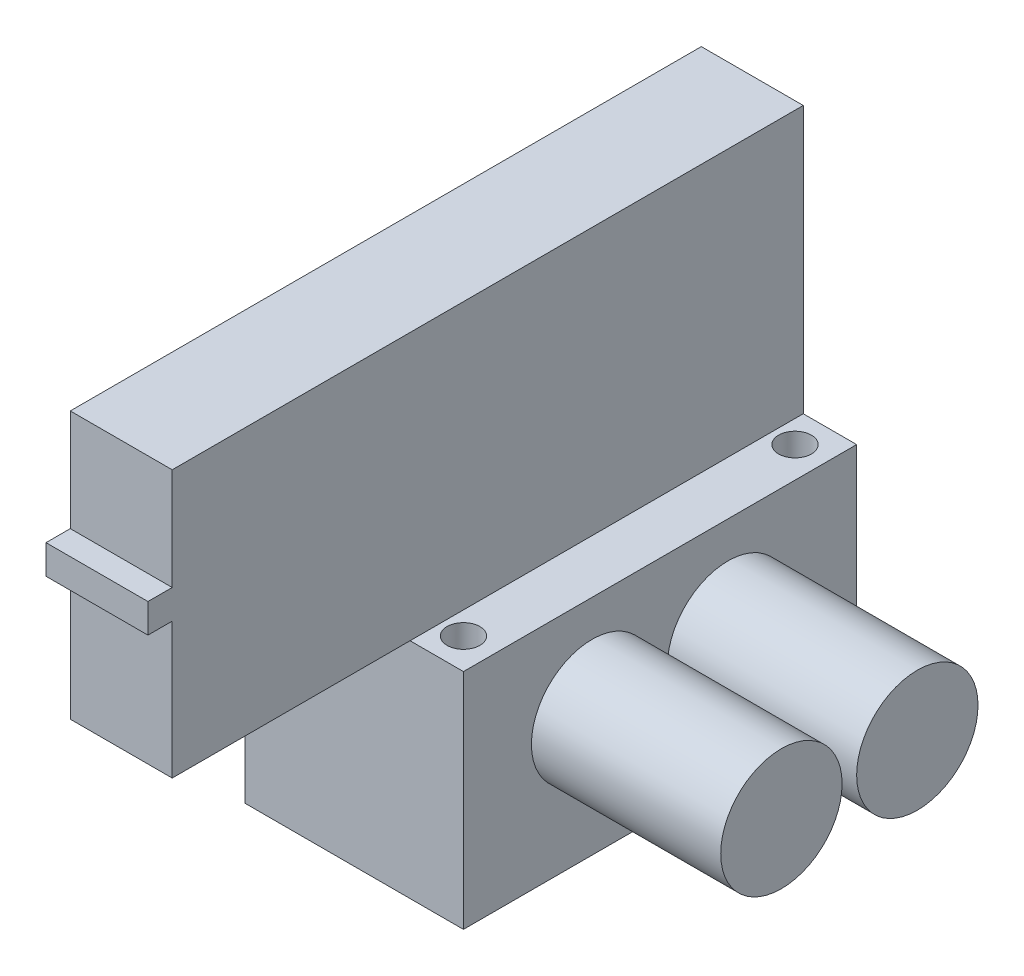
ISO-10303-21;
HEADER;
FILE_DESCRIPTION(('STEP AP214'),'2;1');
FILE_NAME('part.step','',(''),(''),'','','');
FILE_SCHEMA(('AUTOMOTIVE_DESIGN { 1 0 10303 214 1 1 1 1 }'));
ENDSEC;
DATA;
#1=APPLICATION_CONTEXT('core data for automotive mechanical design processes');
#2=APPLICATION_PROTOCOL_DEFINITION('international standard','automotive_design',2000,#1);
#3=PRODUCT_CONTEXT('',#1,'mechanical');
#4=PRODUCT('Part','Part','',(#3));
#5=PRODUCT_RELATED_PRODUCT_CATEGORY('part','',(#4));
#6=PRODUCT_DEFINITION_FORMATION('','',#4);
#7=PRODUCT_DEFINITION_CONTEXT('part definition',#1,'design');
#8=PRODUCT_DEFINITION('design','',#6,#7);
#9=PRODUCT_DEFINITION_SHAPE('','',#8);
#10=(LENGTH_UNIT() NAMED_UNIT(*) SI_UNIT(.MILLI.,.METRE.));
#11=(NAMED_UNIT(*) PLANE_ANGLE_UNIT() SI_UNIT($,.RADIAN.));
#12=(NAMED_UNIT(*) SI_UNIT($,.STERADIAN.) SOLID_ANGLE_UNIT());
#13=UNCERTAINTY_MEASURE_WITH_UNIT(LENGTH_MEASURE(1.E-05),#10,'distance_accuracy_value','');
#14=(GEOMETRIC_REPRESENTATION_CONTEXT(3) GLOBAL_UNCERTAINTY_ASSIGNED_CONTEXT((#13)) GLOBAL_UNIT_ASSIGNED_CONTEXT((#10,
#11,#12)) REPRESENTATION_CONTEXT('',''));
#15=CARTESIAN_POINT('',(0.,0.,0.));
#16=DIRECTION('',(0.,0.,1.));
#17=DIRECTION('',(1.,0.,0.));
#18=AXIS2_PLACEMENT_3D('',#15,#16,#17);
#19=CARTESIAN_POINT('',(6.60400000000001,51.308,24.892));
#20=DIRECTION('',(0.,0.,-1.));
#21=DIRECTION('',(-1.,0.,0.));
#22=AXIS2_PLACEMENT_3D('',#19,#20,#21);
#23=PLANE('',#22);
#24=DIRECTION('',(-1.,0.,0.));
#25=VECTOR('',#24,1.);
#26=CARTESIAN_POINT('',(6.60400000000001,40.64,24.892));
#27=LINE('',#26,#25);
#28=CARTESIAN_POINT('',(17.272,40.64,24.892));
#29=VERTEX_POINT('',#28);
#30=CARTESIAN_POINT('',(6.60400000000001,40.64,24.892));
#31=VERTEX_POINT('',#30);
#32=EDGE_CURVE('E151',#29,#31,#27,.T.);
#33=ORIENTED_EDGE('',*,*,#32,.F.);
#34=DIRECTION('',(0.,-1.,0.));
#35=VECTOR('',#34,1.);
#36=CARTESIAN_POINT('',(17.272,51.308,24.892));
#37=LINE('',#36,#35);
#38=CARTESIAN_POINT('',(17.272,51.308,24.892));
#39=VERTEX_POINT('',#38);
#40=EDGE_CURVE('E216',#39,#29,#37,.T.);
#41=ORIENTED_EDGE('',*,*,#40,.F.);
#42=DIRECTION('',(1.,0.,0.));
#43=VECTOR('',#42,1.);
#44=CARTESIAN_POINT('',(6.60400000000001,51.308,24.892));
#45=LINE('',#44,#43);
#46=CARTESIAN_POINT('',(6.60400000000001,51.308,24.892));
#47=VERTEX_POINT('',#46);
#48=EDGE_CURVE('E187',#47,#39,#45,.T.);
#49=ORIENTED_EDGE('',*,*,#48,.F.);
#50=DIRECTION('',(0.,-1.,0.));
#51=VECTOR('',#50,1.);
#52=CARTESIAN_POINT('',(6.60400000000001,51.308,24.892));
#53=LINE('',#52,#51);
#54=EDGE_CURVE('E60',#47,#31,#53,.T.);
#55=ORIENTED_EDGE('',*,*,#54,.T.);
#56=EDGE_LOOP('',(#33,#41,#49,#55));
#57=FACE_BOUND('',#56,.T.);
#58=ADVANCED_FACE('F35',(#57),#23,.F.);
#59=DIRECTION('',(1.,0.,0.));
#60=VECTOR('',#59,1.);
#61=CARTESIAN_POINT('',(6.60400000000001,37.592,24.892));
#62=LINE('',#61,#60);
#63=CARTESIAN_POINT('',(6.60400000000001,37.592,24.892));
#64=VERTEX_POINT('',#63);
#65=CARTESIAN_POINT('',(17.272,37.592,24.892));
#66=VERTEX_POINT('',#65);
#67=EDGE_CURVE('E52',#64,#66,#62,.T.);
#68=ORIENTED_EDGE('',*,*,#67,.F.);
#69=CARTESIAN_POINT('',(6.60400000000001,23.368,24.892));
#70=VERTEX_POINT('',#69);
#71=EDGE_CURVE('E156',#64,#70,#53,.T.);
#72=ORIENTED_EDGE('',*,*,#71,.T.);
#73=DIRECTION('',(1.,0.,0.));
#74=VECTOR('',#73,1.);
#75=CARTESIAN_POINT('',(6.60400000000001,23.368,24.892));
#76=LINE('',#75,#74);
#77=CARTESIAN_POINT('',(17.272,23.368,24.892));
#78=VERTEX_POINT('',#77);
#79=EDGE_CURVE('E198',#70,#78,#76,.T.);
#80=ORIENTED_EDGE('',*,*,#79,.T.);
#81=EDGE_CURVE('E220',#66,#78,#37,.T.);
#82=ORIENTED_EDGE('',*,*,#81,.F.);
#83=EDGE_LOOP('',(#68,#72,#80,#82));
#84=FACE_BOUND('',#83,.T.);
#85=ADVANCED_FACE('F238',(#84),#23,.F.);
#86=CARTESIAN_POINT('',(22.86,23.368,0.));
#87=DIRECTION('',(-1.,0.,0.));
#88=DIRECTION('',(0.,0.,1.));
#89=AXIS2_PLACEMENT_3D('',#86,#87,#88);
#90=PLANE('',#89);
#91=CARTESIAN_POINT('',(22.86,13.208,-27.686));
#92=DIRECTION('',(-1.,0.,0.));
#93=DIRECTION('',(0.,0.,1.));
#94=AXIS2_PLACEMENT_3D('',#91,#92,#93);
#95=CIRCLE('',#94,6.35);
#96=CARTESIAN_POINT('',(22.86,13.208,-21.336));
#97=VERTEX_POINT('',#96);
#98=EDGE_CURVE('E44',#97,#97,#95,.F.);
#99=ORIENTED_EDGE('',*,*,#98,.F.);
#100=EDGE_LOOP('',(#99));
#101=FACE_BOUND('',#100,.T.);
#102=DIRECTION('',(0.,0.,-1.));
#103=VECTOR('',#102,1.);
#104=CARTESIAN_POINT('',(22.86,0.,0.));
#105=LINE('',#104,#103);
#106=CARTESIAN_POINT('',(22.86,0.,0.));
#107=VERTEX_POINT('',#106);
#108=CARTESIAN_POINT('',(22.86,0.,-41.148));
#109=VERTEX_POINT('',#108);
#110=EDGE_CURVE('E268',#107,#109,#105,.T.);
#111=ORIENTED_EDGE('',*,*,#110,.T.);
#112=DIRECTION('',(0.,-1.,0.));
#113=VECTOR('',#112,1.);
#114=CARTESIAN_POINT('',(22.86,23.368,-41.148));
#115=LINE('',#114,#113);
#116=CARTESIAN_POINT('',(22.86,23.368,-41.148));
#117=VERTEX_POINT('',#116);
#118=EDGE_CURVE('E275',#117,#109,#115,.T.);
#119=ORIENTED_EDGE('',*,*,#118,.F.);
#120=DIRECTION('',(0.,0.,-1.));
#121=VECTOR('',#120,1.);
#122=CARTESIAN_POINT('',(22.86,23.368,0.));
#123=LINE('',#122,#121);
#124=CARTESIAN_POINT('',(22.86,23.368,0.));
#125=VERTEX_POINT('',#124);
#126=EDGE_CURVE('E261',#125,#117,#123,.T.);
#127=ORIENTED_EDGE('',*,*,#126,.F.);
#128=DIRECTION('',(0.,-1.,0.));
#129=VECTOR('',#128,1.);
#130=CARTESIAN_POINT('',(22.86,23.368,0.));
#131=LINE('',#130,#129);
#132=EDGE_CURVE('E278',#125,#107,#131,.T.);
#133=ORIENTED_EDGE('',*,*,#132,.T.);
#134=EDGE_LOOP('',(#111,#119,#127,#133));
#135=FACE_BOUND('',#134,.T.);
#136=CARTESIAN_POINT('',(22.86,13.208,-13.462));
#137=DIRECTION('',(-1.,0.,0.));
#138=DIRECTION('',(0.,0.,1.));
#139=AXIS2_PLACEMENT_3D('',#136,#137,#138);
#140=CIRCLE('',#139,6.35);
#141=CARTESIAN_POINT('',(22.86,13.208,-7.112));
#142=VERTEX_POINT('',#141);
#143=EDGE_CURVE('E11',#142,#142,#140,.F.);
#144=ORIENTED_EDGE('',*,*,#143,.F.);
#145=EDGE_LOOP('',(#144));
#146=FACE_BOUND('',#145,.T.);
#147=ADVANCED_FACE('F299',(#101,#135,#146),#90,.F.);
#148=CARTESIAN_POINT('',(0.,23.368,0.));
#149=DIRECTION('',(1.,0.,0.));
#150=DIRECTION('',(0.,0.,-1.));
#151=AXIS2_PLACEMENT_3D('',#148,#149,#150);
#152=PLANE('',#151);
#153=DIRECTION('',(0.,0.,1.));
#154=VECTOR('',#153,1.);
#155=CARTESIAN_POINT('',(0.,0.,0.));
#156=LINE('',#155,#154);
#157=CARTESIAN_POINT('',(0.,0.,-41.148));
#158=VERTEX_POINT('',#157);
#159=CARTESIAN_POINT('',(0.,0.,0.));
#160=VERTEX_POINT('',#159);
#161=EDGE_CURVE('E233',#158,#160,#156,.T.);
#162=ORIENTED_EDGE('',*,*,#161,.T.);
#163=DIRECTION('',(0.,-1.,0.));
#164=VECTOR('',#163,1.);
#165=CARTESIAN_POINT('',(0.,23.368,0.));
#166=LINE('',#165,#164);
#167=CARTESIAN_POINT('',(0.,23.368,0.));
#168=VERTEX_POINT('',#167);
#169=EDGE_CURVE('E256',#168,#160,#166,.T.);
#170=ORIENTED_EDGE('',*,*,#169,.F.);
#171=DIRECTION('',(0.,0.,1.));
#172=VECTOR('',#171,1.);
#173=CARTESIAN_POINT('',(0.,23.368,0.));
#174=LINE('',#173,#172);
#175=CARTESIAN_POINT('',(0.,23.368,-41.148));
#176=VERTEX_POINT('',#175);
#177=EDGE_CURVE('E228',#176,#168,#174,.T.);
#178=ORIENTED_EDGE('',*,*,#177,.F.);
#179=DIRECTION('',(0.,-1.,0.));
#180=VECTOR('',#179,1.);
#181=CARTESIAN_POINT('',(0.,23.368,-41.148));
#182=LINE('',#181,#180);
#183=EDGE_CURVE('E272',#176,#158,#182,.T.);
#184=ORIENTED_EDGE('',*,*,#183,.T.);
#185=EDGE_LOOP('',(#162,#170,#178,#184));
#186=FACE_BOUND('',#185,.T.);
#187=CARTESIAN_POINT('',(0.,16.256,-20.828));
#188=DIRECTION('',(1.,0.,0.));
#189=DIRECTION('',(0.,0.,-1.));
#190=AXIS2_PLACEMENT_3D('',#187,#188,#189);
#191=CIRCLE('',#190,6.35);
#192=CARTESIAN_POINT('',(0.,16.256,-27.178));
#193=VERTEX_POINT('',#192);
#194=EDGE_CURVE('E210',#193,#193,#191,.F.);
#195=ORIENTED_EDGE('',*,*,#194,.F.);
#196=EDGE_LOOP('',(#195));
#197=FACE_BOUND('',#196,.T.);
#198=ADVANCED_FACE('F37',(#186,#197),#152,.F.);
#199=CARTESIAN_POINT('',(0.,23.368,0.));
#200=DIRECTION('',(0.,-1.,0.));
#201=DIRECTION('',(0.,0.,-1.));
#202=AXIS2_PLACEMENT_3D('',#199,#200,#201);
#203=PLANE('',#202);
#204=DIRECTION('',(0.,0.,1.));
#205=VECTOR('',#204,1.);
#206=CARTESIAN_POINT('',(6.604,23.368,-41.148));
#207=LINE('',#206,#205);
#208=CARTESIAN_POINT('',(6.604,23.368,-41.148));
#209=VERTEX_POINT('',#208);
#210=CARTESIAN_POINT('',(6.604,23.368,0.));
#211=VERTEX_POINT('',#210);
#212=EDGE_CURVE('E197',#209,#211,#207,.T.);
#213=ORIENTED_EDGE('',*,*,#212,.F.);
#214=DIRECTION('',(-1.,0.,0.));
#215=VECTOR('',#214,1.);
#216=CARTESIAN_POINT('',(0.,23.368,-41.148));
#217=LINE('',#216,#215);
#218=EDGE_CURVE('E257',#209,#176,#217,.T.);
#219=ORIENTED_EDGE('',*,*,#218,.T.);
#220=ORIENTED_EDGE('',*,*,#177,.T.);
#221=DIRECTION('',(1.,0.,0.));
#222=VECTOR('',#221,1.);
#223=CARTESIAN_POINT('',(0.,23.368,0.));
#224=LINE('',#223,#222);
#225=EDGE_CURVE('E286',#168,#211,#224,.T.);
#226=ORIENTED_EDGE('',*,*,#225,.T.);
#227=EDGE_LOOP('',(#213,#219,#220,#226));
#228=FACE_BOUND('',#227,.T.);
#229=ADVANCED_FACE('F309',(#228),#203,.F.);
#230=CARTESIAN_POINT('',(19.6342,23.368,-37.9222));
#231=DIRECTION('',(0.,-1.,0.));
#232=DIRECTION('',(0.,0.,-1.));
#233=AXIS2_PLACEMENT_3D('',#230,#231,#232);
#234=CIRCLE('',#233,1.7145);
#235=CARTESIAN_POINT('',(19.6342,23.368,-39.6367));
#236=VERTEX_POINT('',#235);
#237=EDGE_CURVE('E330',#236,#236,#234,.T.);
#238=ORIENTED_EDGE('',*,*,#237,.T.);
#239=EDGE_LOOP('',(#238));
#240=FACE_BOUND('',#239,.T.);
#241=CARTESIAN_POINT('',(19.6342,23.368,-3.2258));
#242=DIRECTION('',(0.,-1.,0.));
#243=DIRECTION('',(0.,0.,-1.));
#244=AXIS2_PLACEMENT_3D('',#241,#242,#243);
#245=CIRCLE('',#244,1.7145);
#246=CARTESIAN_POINT('',(19.6342,23.368,-4.9403));
#247=VERTEX_POINT('',#246);
#248=EDGE_CURVE('E324',#247,#247,#245,.T.);
#249=ORIENTED_EDGE('',*,*,#248,.T.);
#250=EDGE_LOOP('',(#249));
#251=FACE_BOUND('',#250,.T.);
#252=DIRECTION('',(0.,0.,-1.));
#253=VECTOR('',#252,1.);
#254=CARTESIAN_POINT('',(17.272,23.368,-41.148));
#255=LINE('',#254,#253);
#256=CARTESIAN_POINT('',(17.272,23.368,0.));
#257=VERTEX_POINT('',#256);
#258=CARTESIAN_POINT('',(17.272,23.368,-41.148));
#259=VERTEX_POINT('',#258);
#260=EDGE_CURVE('E213',#257,#259,#255,.T.);
#261=ORIENTED_EDGE('',*,*,#260,.F.);
#262=EDGE_CURVE('E306',#257,#125,#224,.T.);
#263=ORIENTED_EDGE('',*,*,#262,.T.);
#264=ORIENTED_EDGE('',*,*,#126,.T.);
#265=EDGE_CURVE('E260',#117,#259,#217,.T.);
#266=ORIENTED_EDGE('',*,*,#265,.T.);
#267=EDGE_LOOP('',(#261,#263,#264,#266));
#268=FACE_BOUND('',#267,.T.);
#269=ADVANCED_FACE('F304',(#240,#251,#268),#203,.F.);
#270=CARTESIAN_POINT('',(0.,23.368,0.));
#271=DIRECTION('',(0.,0.,-1.));
#272=DIRECTION('',(-1.,0.,0.));
#273=AXIS2_PLACEMENT_3D('',#270,#271,#272);
#274=PLANE('',#273);
#275=DIRECTION('',(1.,0.,0.));
#276=VECTOR('',#275,1.);
#277=CARTESIAN_POINT('',(0.,0.,0.));
#278=LINE('',#277,#276);
#279=EDGE_CURVE('E235',#160,#107,#278,.T.);
#280=ORIENTED_EDGE('',*,*,#279,.T.);
#281=ORIENTED_EDGE('',*,*,#132,.F.);
#282=ORIENTED_EDGE('',*,*,#262,.F.);
#283=EDGE_CURVE('E307',#211,#257,#224,.T.);
#284=ORIENTED_EDGE('',*,*,#283,.F.);
#285=ORIENTED_EDGE('',*,*,#225,.F.);
#286=ORIENTED_EDGE('',*,*,#169,.T.);
#287=EDGE_LOOP('',(#280,#281,#282,#284,#285,#286));
#288=FACE_BOUND('',#287,.T.);
#289=ADVANCED_FACE('F283',(#288),#274,.F.);
#290=CARTESIAN_POINT('',(0.,23.368,-41.148));
#291=DIRECTION('',(0.,0.,1.));
#292=DIRECTION('',(1.,0.,0.));
#293=AXIS2_PLACEMENT_3D('',#290,#291,#292);
#294=PLANE('',#293);
#295=DIRECTION('',(-1.,0.,0.));
#296=VECTOR('',#295,1.);
#297=CARTESIAN_POINT('',(0.,0.,-41.148));
#298=LINE('',#297,#296);
#299=EDGE_CURVE('E270',#109,#158,#298,.T.);
#300=ORIENTED_EDGE('',*,*,#299,.T.);
#301=ORIENTED_EDGE('',*,*,#183,.F.);
#302=ORIENTED_EDGE('',*,*,#218,.F.);
#303=DIRECTION('',(0.,-1.,0.));
#304=VECTOR('',#303,1.);
#305=CARTESIAN_POINT('',(6.604,51.308,-41.148));
#306=LINE('',#305,#304);
#307=CARTESIAN_POINT('',(6.604,51.308,-41.148));
#308=VERTEX_POINT('',#307);
#309=EDGE_CURVE('E194',#308,#209,#306,.T.);
#310=ORIENTED_EDGE('',*,*,#309,.F.);
#311=DIRECTION('',(-1.,0.,0.));
#312=VECTOR('',#311,1.);
#313=CARTESIAN_POINT('',(6.604,51.308,-41.148));
#314=LINE('',#313,#312);
#315=CARTESIAN_POINT('',(17.272,51.308,-41.148));
#316=VERTEX_POINT('',#315);
#317=EDGE_CURVE('E192',#316,#308,#314,.T.);
#318=ORIENTED_EDGE('',*,*,#317,.F.);
#319=DIRECTION('',(0.,-1.,0.));
#320=VECTOR('',#319,1.);
#321=CARTESIAN_POINT('',(17.272,51.308,-41.148));
#322=LINE('',#321,#320);
#323=EDGE_CURVE('E207',#316,#259,#322,.T.);
#324=ORIENTED_EDGE('',*,*,#323,.T.);
#325=ORIENTED_EDGE('',*,*,#265,.F.);
#326=ORIENTED_EDGE('',*,*,#118,.T.);
#327=EDGE_LOOP('',(#300,#301,#302,#310,#318,#324,#325,#326));
#328=FACE_BOUND('',#327,.T.);
#329=ADVANCED_FACE('F302',(#328),#294,.F.);
#330=CARTESIAN_POINT('',(0.,0.,0.));
#331=DIRECTION('',(0.,-1.,0.));
#332=DIRECTION('',(0.,0.,-1.));
#333=AXIS2_PLACEMENT_3D('',#330,#331,#332);
#334=PLANE('',#333);
#335=CARTESIAN_POINT('',(19.6342,0.,-37.9222));
#336=DIRECTION('',(0.,-1.,0.));
#337=DIRECTION('',(0.,0.,-1.));
#338=AXIS2_PLACEMENT_3D('',#335,#336,#337);
#339=CIRCLE('',#338,1.7145);
#340=CARTESIAN_POINT('',(19.6342,0.,-39.6367));
#341=VERTEX_POINT('',#340);
#342=EDGE_CURVE('E333',#341,#341,#339,.T.);
#343=ORIENTED_EDGE('',*,*,#342,.F.);
#344=EDGE_LOOP('',(#343));
#345=FACE_BOUND('',#344,.T.);
#346=CARTESIAN_POINT('',(19.6342,0.,-3.2258));
#347=DIRECTION('',(0.,-1.,0.));
#348=DIRECTION('',(0.,0.,-1.));
#349=AXIS2_PLACEMENT_3D('',#346,#347,#348);
#350=CIRCLE('',#349,1.7145);
#351=CARTESIAN_POINT('',(19.6342,0.,-4.9403));
#352=VERTEX_POINT('',#351);
#353=EDGE_CURVE('E327',#352,#352,#350,.T.);
#354=ORIENTED_EDGE('',*,*,#353,.F.);
#355=EDGE_LOOP('',(#354));
#356=FACE_BOUND('',#355,.T.);
#357=ORIENTED_EDGE('',*,*,#161,.F.);
#358=ORIENTED_EDGE('',*,*,#299,.F.);
#359=ORIENTED_EDGE('',*,*,#110,.F.);
#360=ORIENTED_EDGE('',*,*,#279,.F.);
#361=EDGE_LOOP('',(#357,#358,#359,#360));
#362=FACE_BOUND('',#361,.T.);
#363=ADVANCED_FACE('F295',(#345,#356,#362),#334,.T.);
#364=CARTESIAN_POINT('',(0.,23.368,0.));
#365=DIRECTION('',(0.,1.,0.));
#366=DIRECTION('',(0.,0.,1.));
#367=AXIS2_PLACEMENT_3D('',#364,#365,#366);
#368=PLANE('',#367);
#369=EDGE_CURVE('E183',#211,#70,#207,.T.);
#370=ORIENTED_EDGE('',*,*,#369,.F.);
#371=ORIENTED_EDGE('',*,*,#283,.T.);
#372=EDGE_CURVE('E188',#78,#257,#255,.T.);
#373=ORIENTED_EDGE('',*,*,#372,.F.);
#374=ORIENTED_EDGE('',*,*,#79,.F.);
#375=EDGE_LOOP('',(#370,#371,#373,#374));
#376=FACE_BOUND('',#375,.T.);
#377=ADVANCED_FACE('F244',(#376),#368,.F.);
#378=CARTESIAN_POINT('',(6.604,51.308,-41.148));
#379=DIRECTION('',(1.,0.,0.));
#380=DIRECTION('',(0.,0.,-1.));
#381=AXIS2_PLACEMENT_3D('',#378,#379,#380);
#382=PLANE('',#381);
#383=ORIENTED_EDGE('',*,*,#212,.T.);
#384=ORIENTED_EDGE('',*,*,#369,.T.);
#385=ORIENTED_EDGE('',*,*,#71,.F.);
#386=DIRECTION('',(0.,0.,-1.));
#387=VECTOR('',#386,1.);
#388=CARTESIAN_POINT('',(6.60400000000001,37.592,27.432));
#389=LINE('',#388,#387);
#390=CARTESIAN_POINT('',(6.60400000000001,37.592,27.432));
#391=VERTEX_POINT('',#390);
#392=EDGE_CURVE('E136',#391,#64,#389,.T.);
#393=ORIENTED_EDGE('',*,*,#392,.F.);
#394=DIRECTION('',(0.,-1.,0.));
#395=VECTOR('',#394,1.);
#396=CARTESIAN_POINT('',(6.60400000000001,40.64,27.432));
#397=LINE('',#396,#395);
#398=CARTESIAN_POINT('',(6.60400000000001,40.64,27.432));
#399=VERTEX_POINT('',#398);
#400=EDGE_CURVE('E142',#399,#391,#397,.T.);
#401=ORIENTED_EDGE('',*,*,#400,.F.);
#402=DIRECTION('',(0.,0.,-1.));
#403=VECTOR('',#402,1.);
#404=CARTESIAN_POINT('',(6.60400000000001,40.64,27.432));
#405=LINE('',#404,#403);
#406=EDGE_CURVE('E171',#399,#31,#405,.T.);
#407=ORIENTED_EDGE('',*,*,#406,.T.);
#408=ORIENTED_EDGE('',*,*,#54,.F.);
#409=DIRECTION('',(0.,0.,1.));
#410=VECTOR('',#409,1.);
#411=CARTESIAN_POINT('',(6.604,51.308,-41.148));
#412=LINE('',#411,#410);
#413=EDGE_CURVE('E184',#308,#47,#412,.T.);
#414=ORIENTED_EDGE('',*,*,#413,.F.);
#415=ORIENTED_EDGE('',*,*,#309,.T.);
#416=EDGE_LOOP('',(#383,#384,#385,#393,#401,#407,#408,#414,#415));
#417=FACE_BOUND('',#416,.T.);
#418=ADVANCED_FACE('F154',(#417),#382,.F.);
#419=CARTESIAN_POINT('',(17.272,51.308,-41.148));
#420=DIRECTION('',(-1.,0.,0.));
#421=DIRECTION('',(0.,0.,1.));
#422=AXIS2_PLACEMENT_3D('',#419,#420,#421);
#423=PLANE('',#422);
#424=ORIENTED_EDGE('',*,*,#372,.T.);
#425=ORIENTED_EDGE('',*,*,#260,.T.);
#426=ORIENTED_EDGE('',*,*,#323,.F.);
#427=DIRECTION('',(0.,0.,-1.));
#428=VECTOR('',#427,1.);
#429=CARTESIAN_POINT('',(17.272,51.308,-41.148));
#430=LINE('',#429,#428);
#431=EDGE_CURVE('E190',#39,#316,#430,.T.);
#432=ORIENTED_EDGE('',*,*,#431,.F.);
#433=ORIENTED_EDGE('',*,*,#40,.T.);
#434=DIRECTION('',(0.,0.,-1.));
#435=VECTOR('',#434,1.);
#436=CARTESIAN_POINT('',(17.272,40.64,27.432));
#437=LINE('',#436,#435);
#438=CARTESIAN_POINT('',(17.272,40.64,27.432));
#439=VERTEX_POINT('',#438);
#440=EDGE_CURVE('E162',#439,#29,#437,.T.);
#441=ORIENTED_EDGE('',*,*,#440,.F.);
#442=DIRECTION('',(0.,1.,0.));
#443=VECTOR('',#442,1.);
#444=CARTESIAN_POINT('',(17.272,40.64,27.432));
#445=LINE('',#444,#443);
#446=CARTESIAN_POINT('',(17.272,37.592,27.432));
#447=VERTEX_POINT('',#446);
#448=EDGE_CURVE('E141',#447,#439,#445,.T.);
#449=ORIENTED_EDGE('',*,*,#448,.F.);
#450=DIRECTION('',(0.,0.,-1.));
#451=VECTOR('',#450,1.);
#452=CARTESIAN_POINT('',(17.272,37.592,27.432));
#453=LINE('',#452,#451);
#454=EDGE_CURVE('E138',#447,#66,#453,.T.);
#455=ORIENTED_EDGE('',*,*,#454,.T.);
#456=ORIENTED_EDGE('',*,*,#81,.T.);
#457=EDGE_LOOP('',(#424,#425,#426,#432,#433,#441,#449,#455,#456));
#458=FACE_BOUND('',#457,.T.);
#459=ADVANCED_FACE('F248',(#458),#423,.F.);
#460=CARTESIAN_POINT('',(0.,51.308,0.));
#461=DIRECTION('',(0.,1.,0.));
#462=DIRECTION('',(0.,0.,1.));
#463=AXIS2_PLACEMENT_3D('',#460,#461,#462);
#464=PLANE('',#463);
#465=ORIENTED_EDGE('',*,*,#413,.T.);
#466=ORIENTED_EDGE('',*,*,#48,.T.);
#467=ORIENTED_EDGE('',*,*,#431,.T.);
#468=ORIENTED_EDGE('',*,*,#317,.T.);
#469=EDGE_LOOP('',(#465,#466,#467,#468));
#470=FACE_BOUND('',#469,.T.);
#471=ADVANCED_FACE('F314',(#470),#464,.T.);
#472=CARTESIAN_POINT('',(-19.812,16.256,-20.828));
#473=DIRECTION('',(1.,0.,0.));
#474=DIRECTION('',(0.,0.,-1.));
#475=AXIS2_PLACEMENT_3D('',#472,#473,#474);
#476=CYLINDRICAL_SURFACE('',#475,6.35);
#477=CARTESIAN_POINT('',(-19.812,16.256,-20.828));
#478=DIRECTION('',(-1.,0.,0.));
#479=DIRECTION('',(0.,0.,1.));
#480=AXIS2_PLACEMENT_3D('',#477,#478,#479);
#481=CIRCLE('',#480,6.35);
#482=CARTESIAN_POINT('',(-19.812,16.256,-14.478));
#483=VERTEX_POINT('',#482);
#484=EDGE_CURVE('E180',#483,#483,#481,.T.);
#485=ORIENTED_EDGE('',*,*,#484,.F.);
#486=EDGE_LOOP('',(#485));
#487=FACE_BOUND('',#486,.T.);
#488=ORIENTED_EDGE('',*,*,#194,.T.);
#489=EDGE_LOOP('',(#488));
#490=FACE_BOUND('',#489,.T.);
#491=ADVANCED_FACE('F376',(#487,#490),#476,.T.);
#492=CARTESIAN_POINT('',(-19.812,16.256,-20.828));
#493=DIRECTION('',(-1.,0.,0.));
#494=DIRECTION('',(0.,0.,1.));
#495=AXIS2_PLACEMENT_3D('',#492,#493,#494);
#496=PLANE('',#495);
#497=ORIENTED_EDGE('',*,*,#484,.T.);
#498=EDGE_LOOP('',(#497));
#499=FACE_BOUND('',#498,.T.);
#500=ADVANCED_FACE('F379',(#499),#496,.T.);
#501=CARTESIAN_POINT('',(42.672,13.208,-27.686));
#502=DIRECTION('',(-1.,0.,0.));
#503=DIRECTION('',(0.,0.,1.));
#504=AXIS2_PLACEMENT_3D('',#501,#502,#503);
#505=CYLINDRICAL_SURFACE('',#504,6.35);
#506=CARTESIAN_POINT('',(42.672,13.208,-27.686));
#507=DIRECTION('',(1.,0.,0.));
#508=DIRECTION('',(0.,0.,-1.));
#509=AXIS2_PLACEMENT_3D('',#506,#507,#508);
#510=CIRCLE('',#509,6.35);
#511=CARTESIAN_POINT('',(42.672,13.208,-34.036));
#512=VERTEX_POINT('',#511);
#513=EDGE_CURVE('E160',#512,#512,#510,.T.);
#514=ORIENTED_EDGE('',*,*,#513,.F.);
#515=EDGE_LOOP('',(#514));
#516=FACE_BOUND('',#515,.T.);
#517=ORIENTED_EDGE('',*,*,#98,.T.);
#518=EDGE_LOOP('',(#517));
#519=FACE_BOUND('',#518,.T.);
#520=ADVANCED_FACE('F383',(#516,#519),#505,.T.);
#521=CARTESIAN_POINT('',(42.672,13.208,-27.686));
#522=DIRECTION('',(1.,0.,0.));
#523=DIRECTION('',(0.,0.,-1.));
#524=AXIS2_PLACEMENT_3D('',#521,#522,#523);
#525=PLANE('',#524);
#526=ORIENTED_EDGE('',*,*,#513,.T.);
#527=EDGE_LOOP('',(#526));
#528=FACE_BOUND('',#527,.T.);
#529=ADVANCED_FACE('F387',(#528),#525,.T.);
#530=CARTESIAN_POINT('',(42.672,13.208,-13.462));
#531=DIRECTION('',(-1.,0.,0.));
#532=DIRECTION('',(0.,0.,1.));
#533=AXIS2_PLACEMENT_3D('',#530,#531,#532);
#534=CYLINDRICAL_SURFACE('',#533,6.35);
#535=CARTESIAN_POINT('',(42.672,13.208,-13.462));
#536=DIRECTION('',(1.,0.,0.));
#537=DIRECTION('',(0.,0.,-1.));
#538=AXIS2_PLACEMENT_3D('',#535,#536,#537);
#539=CIRCLE('',#538,6.35);
#540=CARTESIAN_POINT('',(42.672,13.208,-19.812));
#541=VERTEX_POINT('',#540);
#542=EDGE_CURVE('E157',#541,#541,#539,.T.);
#543=ORIENTED_EDGE('',*,*,#542,.F.);
#544=EDGE_LOOP('',(#543));
#545=FACE_BOUND('',#544,.T.);
#546=ORIENTED_EDGE('',*,*,#143,.T.);
#547=EDGE_LOOP('',(#546));
#548=FACE_BOUND('',#547,.T.);
#549=ADVANCED_FACE('F391',(#545,#548),#534,.T.);
#550=CARTESIAN_POINT('',(42.672,13.208,-13.462));
#551=DIRECTION('',(1.,0.,0.));
#552=DIRECTION('',(0.,0.,-1.));
#553=AXIS2_PLACEMENT_3D('',#550,#551,#552);
#554=PLANE('',#553);
#555=ORIENTED_EDGE('',*,*,#542,.T.);
#556=EDGE_LOOP('',(#555));
#557=FACE_BOUND('',#556,.T.);
#558=ADVANCED_FACE('F395',(#557),#554,.T.);
#559=CARTESIAN_POINT('',(6.60400000000001,37.592,27.432));
#560=DIRECTION('',(0.,1.,0.));
#561=DIRECTION('',(0.,0.,1.));
#562=AXIS2_PLACEMENT_3D('',#559,#560,#561);
#563=PLANE('',#562);
#564=ORIENTED_EDGE('',*,*,#67,.T.);
#565=ORIENTED_EDGE('',*,*,#454,.F.);
#566=DIRECTION('',(1.,0.,0.));
#567=VECTOR('',#566,1.);
#568=CARTESIAN_POINT('',(6.60400000000001,37.592,27.432));
#569=LINE('',#568,#567);
#570=EDGE_CURVE('E132',#391,#447,#569,.T.);
#571=ORIENTED_EDGE('',*,*,#570,.F.);
#572=ORIENTED_EDGE('',*,*,#392,.T.);
#573=EDGE_LOOP('',(#564,#565,#571,#572));
#574=FACE_BOUND('',#573,.T.);
#575=ADVANCED_FACE('F134',(#574),#563,.F.);
#576=CARTESIAN_POINT('',(6.60400000000001,40.64,27.432));
#577=DIRECTION('',(0.,-1.,0.));
#578=DIRECTION('',(0.,0.,-1.));
#579=AXIS2_PLACEMENT_3D('',#576,#577,#578);
#580=PLANE('',#579);
#581=ORIENTED_EDGE('',*,*,#32,.T.);
#582=ORIENTED_EDGE('',*,*,#406,.F.);
#583=DIRECTION('',(-1.,0.,0.));
#584=VECTOR('',#583,1.);
#585=CARTESIAN_POINT('',(6.60400000000001,40.64,27.432));
#586=LINE('',#585,#584);
#587=EDGE_CURVE('E147',#439,#399,#586,.T.);
#588=ORIENTED_EDGE('',*,*,#587,.F.);
#589=ORIENTED_EDGE('',*,*,#440,.T.);
#590=EDGE_LOOP('',(#581,#582,#588,#589));
#591=FACE_BOUND('',#590,.T.);
#592=ADVANCED_FACE('F320',(#591),#580,.F.);
#593=CARTESIAN_POINT('',(0.,0.,27.432));
#594=DIRECTION('',(0.,0.,1.));
#595=DIRECTION('',(1.,0.,0.));
#596=AXIS2_PLACEMENT_3D('',#593,#594,#595);
#597=PLANE('',#596);
#598=ORIENTED_EDGE('',*,*,#400,.T.);
#599=ORIENTED_EDGE('',*,*,#570,.T.);
#600=ORIENTED_EDGE('',*,*,#448,.T.);
#601=ORIENTED_EDGE('',*,*,#587,.T.);
#602=EDGE_LOOP('',(#598,#599,#600,#601));
#603=FACE_BOUND('',#602,.T.);
#604=ADVANCED_FACE('F145',(#603),#597,.T.);
#605=CARTESIAN_POINT('',(19.6342,51.308025,-3.2258));
#606=DIRECTION('',(0.,-1.,0.));
#607=DIRECTION('',(0.,0.,-1.));
#608=AXIS2_PLACEMENT_3D('',#605,#606,#607);
#609=CYLINDRICAL_SURFACE('',#608,1.7145);
#610=ORIENTED_EDGE('',*,*,#353,.T.);
#611=EDGE_LOOP('',(#610));
#612=FACE_BOUND('',#611,.T.);
#613=ORIENTED_EDGE('',*,*,#248,.F.);
#614=EDGE_LOOP('',(#613));
#615=FACE_BOUND('',#614,.T.);
#616=ADVANCED_FACE('F345',(#612,#615),#609,.F.);
#617=CARTESIAN_POINT('',(19.6342,51.308025,-37.9222));
#618=DIRECTION('',(0.,-1.,0.));
#619=DIRECTION('',(0.,0.,-1.));
#620=AXIS2_PLACEMENT_3D('',#617,#618,#619);
#621=CYLINDRICAL_SURFACE('',#620,1.7145);
#622=ORIENTED_EDGE('',*,*,#342,.T.);
#623=EDGE_LOOP('',(#622));
#624=FACE_BOUND('',#623,.T.);
#625=ORIENTED_EDGE('',*,*,#237,.F.);
#626=EDGE_LOOP('',(#625));
#627=FACE_BOUND('',#626,.T.);
#628=ADVANCED_FACE('F337',(#624,#627),#621,.F.);
#629=CLOSED_SHELL('',(#58,#85,#147,#198,#229,#269,#289,#329,#363,#377,#418,#459,#471,#491,#500,
#520,#529,#549,#558,#575,#592,#604,#616,#628));
#630=MANIFOLD_SOLID_BREP('B2',#629);
#631=ADVANCED_BREP_SHAPE_REPRESENTATION('',(#18,#630),#14);
#632=SHAPE_DEFINITION_REPRESENTATION(#9,#631);
ENDSEC;
END-ISO-10303-21;
